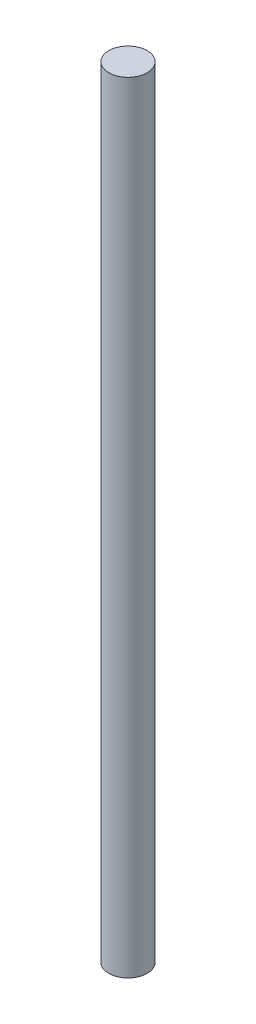
ISO-10303-21;
HEADER;
FILE_DESCRIPTION(('STEP AP214'),'2;1');
FILE_NAME('part.step','',(''),(''),'','','');
FILE_SCHEMA(('AUTOMOTIVE_DESIGN { 1 0 10303 214 1 1 1 1 }'));
ENDSEC;
DATA;
#1=APPLICATION_CONTEXT('core data for automotive mechanical design processes');
#2=APPLICATION_PROTOCOL_DEFINITION('international standard','automotive_design',2000,#1);
#3=PRODUCT_CONTEXT('',#1,'mechanical');
#4=PRODUCT('Part','Part','',(#3));
#5=PRODUCT_RELATED_PRODUCT_CATEGORY('part','',(#4));
#6=PRODUCT_DEFINITION_FORMATION('','',#4);
#7=PRODUCT_DEFINITION_CONTEXT('part definition',#1,'design');
#8=PRODUCT_DEFINITION('design','',#6,#7);
#9=PRODUCT_DEFINITION_SHAPE('','',#8);
#10=(LENGTH_UNIT() NAMED_UNIT(*) SI_UNIT(.MILLI.,.METRE.));
#11=(NAMED_UNIT(*) PLANE_ANGLE_UNIT() SI_UNIT($,.RADIAN.));
#12=(NAMED_UNIT(*) SI_UNIT($,.STERADIAN.) SOLID_ANGLE_UNIT());
#13=UNCERTAINTY_MEASURE_WITH_UNIT(LENGTH_MEASURE(1.E-05),#10,'distance_accuracy_value','');
#14=(GEOMETRIC_REPRESENTATION_CONTEXT(3) GLOBAL_UNCERTAINTY_ASSIGNED_CONTEXT((#13)) GLOBAL_UNIT_ASSIGNED_CONTEXT((#10,
#11,#12)) REPRESENTATION_CONTEXT('',''));
#15=CARTESIAN_POINT('',(0.,0.,0.));
#16=DIRECTION('',(0.,0.,1.));
#17=DIRECTION('',(1.,0.,0.));
#18=AXIS2_PLACEMENT_3D('',#15,#16,#17);
#19=CARTESIAN_POINT('',(0.,101.6,0.));
#20=DIRECTION('',(0.,-1.,0.));
#21=DIRECTION('',(0.,0.,-1.));
#22=AXIS2_PLACEMENT_3D('',#19,#20,#21);
#23=CYLINDRICAL_SURFACE('',#22,2.5);
#24=CARTESIAN_POINT('',(0.,101.6,0.));
#25=DIRECTION('',(0.,1.,0.));
#26=DIRECTION('',(0.,0.,1.));
#27=AXIS2_PLACEMENT_3D('',#24,#25,#26);
#28=CIRCLE('',#27,2.5);
#29=CARTESIAN_POINT('',(0.,101.6,2.5));
#30=VERTEX_POINT('',#29);
#31=EDGE_CURVE('E10',#30,#30,#28,.T.);
#32=ORIENTED_EDGE('',*,*,#31,.F.);
#33=EDGE_LOOP('',(#32));
#34=FACE_BOUND('',#33,.T.);
#35=CARTESIAN_POINT('',(0.,0.,0.));
#36=DIRECTION('',(0.,1.,0.));
#37=DIRECTION('',(0.,0.,1.));
#38=AXIS2_PLACEMENT_3D('',#35,#36,#37);
#39=CIRCLE('',#38,2.5);
#40=CARTESIAN_POINT('',(0.,0.,2.5));
#41=VERTEX_POINT('',#40);
#42=EDGE_CURVE('E42',#41,#41,#39,.T.);
#43=ORIENTED_EDGE('',*,*,#42,.T.);
#44=EDGE_LOOP('',(#43));
#45=FACE_BOUND('',#44,.T.);
#46=ADVANCED_FACE('F41',(#34,#45),#23,.T.);
#47=CARTESIAN_POINT('',(0.,101.6,0.));
#48=DIRECTION('',(0.,1.,0.));
#49=DIRECTION('',(0.,0.,1.));
#50=AXIS2_PLACEMENT_3D('',#47,#48,#49);
#51=PLANE('',#50);
#52=ORIENTED_EDGE('',*,*,#31,.T.);
#53=EDGE_LOOP('',(#52));
#54=FACE_BOUND('',#53,.T.);
#55=ADVANCED_FACE('F57',(#54),#51,.T.);
#56=CARTESIAN_POINT('',(0.,0.,0.));
#57=DIRECTION('',(0.,1.,0.));
#58=DIRECTION('',(0.,0.,1.));
#59=AXIS2_PLACEMENT_3D('',#56,#57,#58);
#60=PLANE('',#59);
#61=ORIENTED_EDGE('',*,*,#42,.F.);
#62=EDGE_LOOP('',(#61));
#63=FACE_BOUND('',#62,.T.);
#64=ADVANCED_FACE('F53',(#63),#60,.F.);
#65=CLOSED_SHELL('',(#46,#55,#64));
#66=MANIFOLD_SOLID_BREP('B2',#65);
#67=ADVANCED_BREP_SHAPE_REPRESENTATION('',(#18,#66),#14);
#68=SHAPE_DEFINITION_REPRESENTATION(#9,#67);
ENDSEC;
END-ISO-10303-21;
